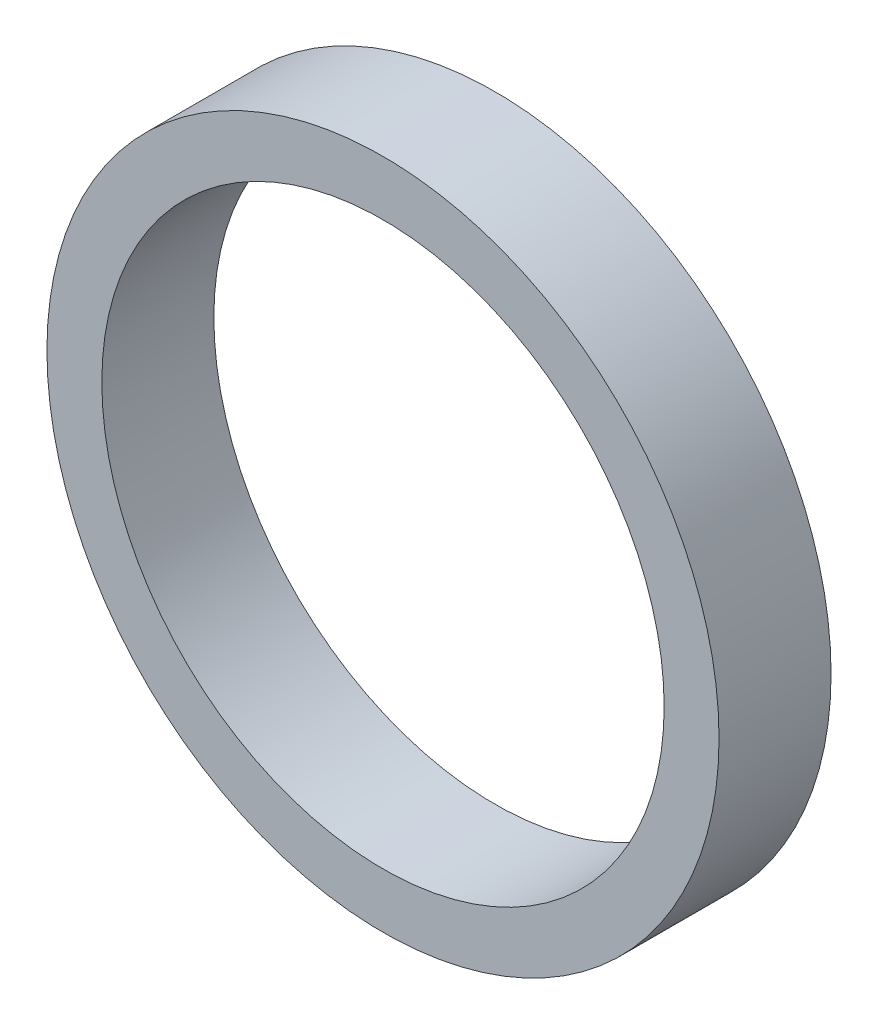
ISO-10303-21;
HEADER;
FILE_DESCRIPTION(('STEP AP214'),'2;1');
FILE_NAME('part.step','',(''),(''),'','','');
FILE_SCHEMA(('AUTOMOTIVE_DESIGN { 1 0 10303 214 1 1 1 1 }'));
ENDSEC;
DATA;
#1=APPLICATION_CONTEXT('core data for automotive mechanical design processes');
#2=APPLICATION_PROTOCOL_DEFINITION('international standard','automotive_design',2000,#1);
#3=PRODUCT_CONTEXT('',#1,'mechanical');
#4=PRODUCT('Part','Part','',(#3));
#5=PRODUCT_RELATED_PRODUCT_CATEGORY('part','',(#4));
#6=PRODUCT_DEFINITION_FORMATION('','',#4);
#7=PRODUCT_DEFINITION_CONTEXT('part definition',#1,'design');
#8=PRODUCT_DEFINITION('design','',#6,#7);
#9=PRODUCT_DEFINITION_SHAPE('','',#8);
#10=(LENGTH_UNIT() NAMED_UNIT(*) SI_UNIT(.MILLI.,.METRE.));
#11=(NAMED_UNIT(*) PLANE_ANGLE_UNIT() SI_UNIT($,.RADIAN.));
#12=(NAMED_UNIT(*) SI_UNIT($,.STERADIAN.) SOLID_ANGLE_UNIT());
#13=UNCERTAINTY_MEASURE_WITH_UNIT(LENGTH_MEASURE(1.E-05),#10,'distance_accuracy_value','');
#14=(GEOMETRIC_REPRESENTATION_CONTEXT(3) GLOBAL_UNCERTAINTY_ASSIGNED_CONTEXT((#13)) GLOBAL_UNIT_ASSIGNED_CONTEXT((#10,
#11,#12)) REPRESENTATION_CONTEXT('',''));
#15=CARTESIAN_POINT('',(0.,0.,0.));
#16=DIRECTION('',(0.,0.,1.));
#17=DIRECTION('',(1.,0.,0.));
#18=AXIS2_PLACEMENT_3D('',#15,#16,#17);
#19=CARTESIAN_POINT('',(0.,0.,3.175));
#20=DIRECTION('',(0.,0.,1.));
#21=DIRECTION('',(1.,0.,0.));
#22=AXIS2_PLACEMENT_3D('',#19,#20,#21);
#23=PLANE('',#22);
#24=CARTESIAN_POINT('',(0.,0.,3.175));
#25=DIRECTION('',(0.,0.,1.));
#26=DIRECTION('',(1.,0.,0.));
#27=AXIS2_PLACEMENT_3D('',#24,#25,#26);
#28=CIRCLE('',#27,19.05);
#29=CARTESIAN_POINT('',(19.05,0.,3.175));
#30=VERTEX_POINT('',#29);
#31=EDGE_CURVE('E10',#30,#30,#28,.T.);
#32=ORIENTED_EDGE('',*,*,#31,.T.);
#33=EDGE_LOOP('',(#32));
#34=FACE_BOUND('',#33,.T.);
#35=CARTESIAN_POINT('',(0.,0.,3.175));
#36=DIRECTION('',(0.,0.,1.));
#37=DIRECTION('',(1.,0.,0.));
#38=AXIS2_PLACEMENT_3D('',#35,#36,#37);
#39=CIRCLE('',#38,15.9385);
#40=CARTESIAN_POINT('',(15.9385,0.,3.175));
#41=VERTEX_POINT('',#40);
#42=EDGE_CURVE('E50',#41,#41,#39,.T.);
#43=ORIENTED_EDGE('',*,*,#42,.F.);
#44=EDGE_LOOP('',(#43));
#45=FACE_BOUND('',#44,.T.);
#46=ADVANCED_FACE('F35',(#34,#45),#23,.T.);
#47=CARTESIAN_POINT('',(0.,0.,-3.175));
#48=DIRECTION('',(0.,0.,1.));
#49=DIRECTION('',(1.,0.,0.));
#50=AXIS2_PLACEMENT_3D('',#47,#48,#49);
#51=PLANE('',#50);
#52=CARTESIAN_POINT('',(0.,0.,-3.175));
#53=DIRECTION('',(0.,0.,1.));
#54=DIRECTION('',(1.,0.,0.));
#55=AXIS2_PLACEMENT_3D('',#52,#53,#54);
#56=CIRCLE('',#55,19.05);
#57=CARTESIAN_POINT('',(19.05,0.,-3.175));
#58=VERTEX_POINT('',#57);
#59=EDGE_CURVE('E39',#58,#58,#56,.T.);
#60=ORIENTED_EDGE('',*,*,#59,.F.);
#61=EDGE_LOOP('',(#60));
#62=FACE_BOUND('',#61,.T.);
#63=CARTESIAN_POINT('',(0.,0.,-3.175));
#64=DIRECTION('',(0.,0.,1.));
#65=DIRECTION('',(1.,0.,0.));
#66=AXIS2_PLACEMENT_3D('',#63,#64,#65);
#67=CIRCLE('',#66,15.9385);
#68=CARTESIAN_POINT('',(15.9385,0.,-3.175));
#69=VERTEX_POINT('',#68);
#70=EDGE_CURVE('E52',#69,#69,#67,.T.);
#71=ORIENTED_EDGE('',*,*,#70,.T.);
#72=EDGE_LOOP('',(#71));
#73=FACE_BOUND('',#72,.T.);
#74=ADVANCED_FACE('F62',(#62,#73),#51,.F.);
#75=CARTESIAN_POINT('',(0.,0.,3.175));
#76=DIRECTION('',(0.,0.,-1.));
#77=DIRECTION('',(-1.,0.,0.));
#78=AXIS2_PLACEMENT_3D('',#75,#76,#77);
#79=CYLINDRICAL_SURFACE('',#78,19.05);
#80=ORIENTED_EDGE('',*,*,#31,.F.);
#81=EDGE_LOOP('',(#80));
#82=FACE_BOUND('',#81,.T.);
#83=ORIENTED_EDGE('',*,*,#59,.T.);
#84=EDGE_LOOP('',(#83));
#85=FACE_BOUND('',#84,.T.);
#86=ADVANCED_FACE('F37',(#82,#85),#79,.T.);
#87=CARTESIAN_POINT('',(0.,0.,3.175));
#88=DIRECTION('',(0.,0.,-1.));
#89=DIRECTION('',(-1.,0.,0.));
#90=AXIS2_PLACEMENT_3D('',#87,#88,#89);
#91=CYLINDRICAL_SURFACE('',#90,15.9385);
#92=ORIENTED_EDGE('',*,*,#42,.T.);
#93=EDGE_LOOP('',(#92));
#94=FACE_BOUND('',#93,.T.);
#95=ORIENTED_EDGE('',*,*,#70,.F.);
#96=EDGE_LOOP('',(#95));
#97=FACE_BOUND('',#96,.T.);
#98=ADVANCED_FACE('F58',(#94,#97),#91,.F.);
#99=CLOSED_SHELL('',(#46,#74,#86,#98));
#100=MANIFOLD_SOLID_BREP('B2',#99);
#101=ADVANCED_BREP_SHAPE_REPRESENTATION('',(#18,#100),#14);
#102=SHAPE_DEFINITION_REPRESENTATION(#9,#101);
ENDSEC;
END-ISO-10303-21;
